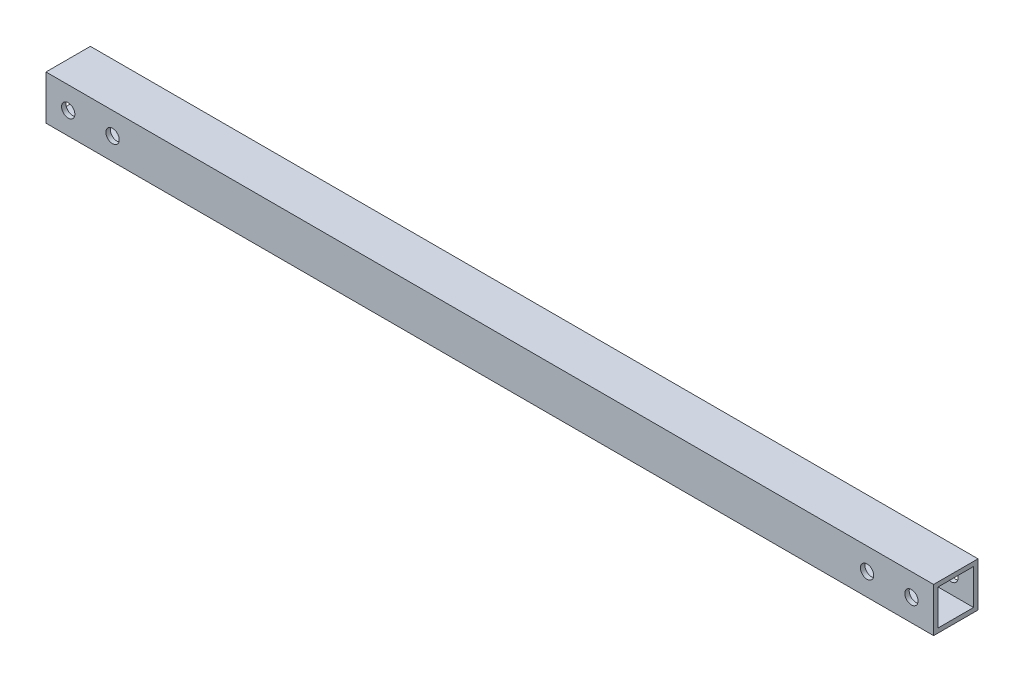
ISO-10303-21;
HEADER;
FILE_DESCRIPTION(('STEP AP214'),'2;1');
FILE_NAME('part.step','',(''),(''),'','','');
FILE_SCHEMA(('AUTOMOTIVE_DESIGN { 1 0 10303 214 1 1 1 1 }'));
ENDSEC;
DATA;
#1=APPLICATION_CONTEXT('core data for automotive mechanical design processes');
#2=APPLICATION_PROTOCOL_DEFINITION('international standard','automotive_design',2000,#1);
#3=PRODUCT_CONTEXT('',#1,'mechanical');
#4=PRODUCT('Part','Part','',(#3));
#5=PRODUCT_RELATED_PRODUCT_CATEGORY('part','',(#4));
#6=PRODUCT_DEFINITION_FORMATION('','',#4);
#7=PRODUCT_DEFINITION_CONTEXT('part definition',#1,'design');
#8=PRODUCT_DEFINITION('design','',#6,#7);
#9=PRODUCT_DEFINITION_SHAPE('','',#8);
#10=(LENGTH_UNIT() NAMED_UNIT(*) SI_UNIT(.MILLI.,.METRE.));
#11=(NAMED_UNIT(*) PLANE_ANGLE_UNIT() SI_UNIT($,.RADIAN.));
#12=(NAMED_UNIT(*) SI_UNIT($,.STERADIAN.) SOLID_ANGLE_UNIT());
#13=UNCERTAINTY_MEASURE_WITH_UNIT(LENGTH_MEASURE(1.E-05),#10,'distance_accuracy_value','');
#14=(GEOMETRIC_REPRESENTATION_CONTEXT(3) GLOBAL_UNCERTAINTY_ASSIGNED_CONTEXT((#13)) GLOBAL_UNIT_ASSIGNED_CONTEXT((#10,
#11,#12)) REPRESENTATION_CONTEXT('',''));
#15=CARTESIAN_POINT('',(0.,0.,0.));
#16=DIRECTION('',(0.,0.,1.));
#17=DIRECTION('',(1.,0.,0.));
#18=AXIS2_PLACEMENT_3D('',#15,#16,#17);
#19=CARTESIAN_POINT('',(200.,0.,0.));
#20=DIRECTION('',(1.,0.,0.));
#21=DIRECTION('',(0.,0.,-1.));
#22=AXIS2_PLACEMENT_3D('',#19,#20,#21);
#23=PLANE('',#22);
#24=DIRECTION('',(0.,-1.,0.));
#25=VECTOR('',#24,1.);
#26=CARTESIAN_POINT('',(200.,10.,10.));
#27=LINE('',#26,#25);
#28=CARTESIAN_POINT('',(200.,10.,10.));
#29=VERTEX_POINT('',#28);
#30=CARTESIAN_POINT('',(200.,-10.,10.));
#31=VERTEX_POINT('',#30);
#32=EDGE_CURVE('E140',#29,#31,#27,.T.);
#33=ORIENTED_EDGE('',*,*,#32,.T.);
#34=DIRECTION('',(0.,0.,-1.));
#35=VECTOR('',#34,1.);
#36=CARTESIAN_POINT('',(200.,-10.,10.));
#37=LINE('',#36,#35);
#38=CARTESIAN_POINT('',(200.,-10.,-10.));
#39=VERTEX_POINT('',#38);
#40=EDGE_CURVE('E143',#31,#39,#37,.T.);
#41=ORIENTED_EDGE('',*,*,#40,.T.);
#42=DIRECTION('',(0.,1.,0.));
#43=VECTOR('',#42,1.);
#44=CARTESIAN_POINT('',(200.,10.,-10.));
#45=LINE('',#44,#43);
#46=CARTESIAN_POINT('',(200.,10.,-10.));
#47=VERTEX_POINT('',#46);
#48=EDGE_CURVE('E146',#39,#47,#45,.T.);
#49=ORIENTED_EDGE('',*,*,#48,.T.);
#50=DIRECTION('',(0.,0.,1.));
#51=VECTOR('',#50,1.);
#52=CARTESIAN_POINT('',(200.,10.,10.));
#53=LINE('',#52,#51);
#54=EDGE_CURVE('E148',#47,#29,#53,.T.);
#55=ORIENTED_EDGE('',*,*,#54,.T.);
#56=EDGE_LOOP('',(#33,#41,#49,#55));
#57=FACE_BOUND('',#56,.T.);
#58=DIRECTION('',(0.,1.,0.));
#59=VECTOR('',#58,1.);
#60=CARTESIAN_POINT('',(200.,8.,-8.));
#61=LINE('',#60,#59);
#62=CARTESIAN_POINT('',(200.,-8.,-8.));
#63=VERTEX_POINT('',#62);
#64=CARTESIAN_POINT('',(200.,8.,-8.));
#65=VERTEX_POINT('',#64);
#66=EDGE_CURVE('E110',#63,#65,#61,.T.);
#67=ORIENTED_EDGE('',*,*,#66,.F.);
#68=DIRECTION('',(0.,0.,-1.));
#69=VECTOR('',#68,1.);
#70=CARTESIAN_POINT('',(200.,-8.,-8.));
#71=LINE('',#70,#69);
#72=CARTESIAN_POINT('',(200.,-8.,8.));
#73=VERTEX_POINT('',#72);
#74=EDGE_CURVE('E102',#73,#63,#71,.T.);
#75=ORIENTED_EDGE('',*,*,#74,.F.);
#76=DIRECTION('',(0.,-1.,0.));
#77=VECTOR('',#76,1.);
#78=CARTESIAN_POINT('',(200.,8.,8.));
#79=LINE('',#78,#77);
#80=CARTESIAN_POINT('',(200.,8.,8.));
#81=VERTEX_POINT('',#80);
#82=EDGE_CURVE('E124',#81,#73,#79,.T.);
#83=ORIENTED_EDGE('',*,*,#82,.F.);
#84=DIRECTION('',(0.,0.,1.));
#85=VECTOR('',#84,1.);
#86=CARTESIAN_POINT('',(200.,8.,-8.));
#87=LINE('',#86,#85);
#88=EDGE_CURVE('E122',#65,#81,#87,.T.);
#89=ORIENTED_EDGE('',*,*,#88,.F.);
#90=EDGE_LOOP('',(#67,#75,#83,#89));
#91=FACE_BOUND('',#90,.T.);
#92=ADVANCED_FACE('F35',(#57,#91),#23,.T.);
#93=CARTESIAN_POINT('',(-200.,0.,0.));
#94=DIRECTION('',(1.,0.,0.));
#95=DIRECTION('',(0.,0.,-1.));
#96=AXIS2_PLACEMENT_3D('',#93,#94,#95);
#97=PLANE('',#96);
#98=DIRECTION('',(0.,-1.,0.));
#99=VECTOR('',#98,1.);
#100=CARTESIAN_POINT('',(-200.,10.,10.));
#101=LINE('',#100,#99);
#102=CARTESIAN_POINT('',(-200.,10.,10.));
#103=VERTEX_POINT('',#102);
#104=CARTESIAN_POINT('',(-200.,-10.,10.));
#105=VERTEX_POINT('',#104);
#106=EDGE_CURVE('E118',#103,#105,#101,.T.);
#107=ORIENTED_EDGE('',*,*,#106,.F.);
#108=DIRECTION('',(0.,0.,1.));
#109=VECTOR('',#108,1.);
#110=CARTESIAN_POINT('',(-200.,10.,10.));
#111=LINE('',#110,#109);
#112=CARTESIAN_POINT('',(-200.,10.,-10.));
#113=VERTEX_POINT('',#112);
#114=EDGE_CURVE('E144',#113,#103,#111,.T.);
#115=ORIENTED_EDGE('',*,*,#114,.F.);
#116=DIRECTION('',(0.,1.,0.));
#117=VECTOR('',#116,1.);
#118=CARTESIAN_POINT('',(-200.,10.,-10.));
#119=LINE('',#118,#117);
#120=CARTESIAN_POINT('',(-200.,-10.,-10.));
#121=VERTEX_POINT('',#120);
#122=EDGE_CURVE('E155',#121,#113,#119,.T.);
#123=ORIENTED_EDGE('',*,*,#122,.F.);
#124=DIRECTION('',(0.,0.,-1.));
#125=VECTOR('',#124,1.);
#126=CARTESIAN_POINT('',(-200.,-10.,10.));
#127=LINE('',#126,#125);
#128=EDGE_CURVE('E153',#105,#121,#127,.T.);
#129=ORIENTED_EDGE('',*,*,#128,.F.);
#130=EDGE_LOOP('',(#107,#115,#123,#129));
#131=FACE_BOUND('',#130,.T.);
#132=DIRECTION('',(0.,0.,-1.));
#133=VECTOR('',#132,1.);
#134=CARTESIAN_POINT('',(-200.,-8.,-8.));
#135=LINE('',#134,#133);
#136=CARTESIAN_POINT('',(-200.,-8.,8.));
#137=VERTEX_POINT('',#136);
#138=CARTESIAN_POINT('',(-200.,-8.,-8.));
#139=VERTEX_POINT('',#138);
#140=EDGE_CURVE('E60',#137,#139,#135,.T.);
#141=ORIENTED_EDGE('',*,*,#140,.T.);
#142=DIRECTION('',(0.,1.,0.));
#143=VECTOR('',#142,1.);
#144=CARTESIAN_POINT('',(-200.,8.,-8.));
#145=LINE('',#144,#143);
#146=CARTESIAN_POINT('',(-200.,8.,-8.));
#147=VERTEX_POINT('',#146);
#148=EDGE_CURVE('E117',#139,#147,#145,.T.);
#149=ORIENTED_EDGE('',*,*,#148,.T.);
#150=DIRECTION('',(0.,0.,1.));
#151=VECTOR('',#150,1.);
#152=CARTESIAN_POINT('',(-200.,8.,-8.));
#153=LINE('',#152,#151);
#154=CARTESIAN_POINT('',(-200.,8.,8.));
#155=VERTEX_POINT('',#154);
#156=EDGE_CURVE('E132',#147,#155,#153,.T.);
#157=ORIENTED_EDGE('',*,*,#156,.T.);
#158=DIRECTION('',(0.,-1.,0.));
#159=VECTOR('',#158,1.);
#160=CARTESIAN_POINT('',(-200.,8.,8.));
#161=LINE('',#160,#159);
#162=EDGE_CURVE('E111',#155,#137,#161,.T.);
#163=ORIENTED_EDGE('',*,*,#162,.T.);
#164=EDGE_LOOP('',(#141,#149,#157,#163));
#165=FACE_BOUND('',#164,.T.);
#166=ADVANCED_FACE('F227',(#131,#165),#97,.F.);
#167=CARTESIAN_POINT('',(200.,10.,10.));
#168=DIRECTION('',(0.,0.,-1.));
#169=DIRECTION('',(-1.,0.,0.));
#170=AXIS2_PLACEMENT_3D('',#167,#168,#169);
#171=PLANE('',#170);
#172=CARTESIAN_POINT('',(-190.,0.,10.));
#173=DIRECTION('',(0.,0.,1.));
#174=DIRECTION('',(1.,0.,0.));
#175=AXIS2_PLACEMENT_3D('',#172,#173,#174);
#176=CIRCLE('',#175,2.99999999999999);
#177=CARTESIAN_POINT('',(-187.,0.,10.));
#178=VERTEX_POINT('',#177);
#179=EDGE_CURVE('E299',#178,#178,#176,.T.);
#180=ORIENTED_EDGE('',*,*,#179,.F.);
#181=EDGE_LOOP('',(#180));
#182=FACE_BOUND('',#181,.T.);
#183=CARTESIAN_POINT('',(-170.,0.,10.));
#184=DIRECTION('',(0.,0.,1.));
#185=DIRECTION('',(1.,0.,0.));
#186=AXIS2_PLACEMENT_3D('',#183,#184,#185);
#187=CIRCLE('',#186,2.99999999999999);
#188=CARTESIAN_POINT('',(-167.,0.,10.));
#189=VERTEX_POINT('',#188);
#190=EDGE_CURVE('E183',#189,#189,#187,.T.);
#191=ORIENTED_EDGE('',*,*,#190,.F.);
#192=EDGE_LOOP('',(#191));
#193=FACE_BOUND('',#192,.T.);
#194=CARTESIAN_POINT('',(170.,0.,10.));
#195=DIRECTION('',(0.,0.,1.));
#196=DIRECTION('',(1.,0.,0.));
#197=AXIS2_PLACEMENT_3D('',#194,#195,#196);
#198=CIRCLE('',#197,2.99999999999999);
#199=CARTESIAN_POINT('',(173.,0.,10.));
#200=VERTEX_POINT('',#199);
#201=EDGE_CURVE('E180',#200,#200,#198,.T.);
#202=ORIENTED_EDGE('',*,*,#201,.F.);
#203=EDGE_LOOP('',(#202));
#204=FACE_BOUND('',#203,.T.);
#205=CARTESIAN_POINT('',(190.,0.,10.));
#206=DIRECTION('',(0.,0.,1.));
#207=DIRECTION('',(1.,0.,0.));
#208=AXIS2_PLACEMENT_3D('',#205,#206,#207);
#209=CIRCLE('',#208,2.99999999999999);
#210=CARTESIAN_POINT('',(193.,0.,10.));
#211=VERTEX_POINT('',#210);
#212=EDGE_CURVE('E199',#211,#211,#209,.T.);
#213=ORIENTED_EDGE('',*,*,#212,.F.);
#214=EDGE_LOOP('',(#213));
#215=FACE_BOUND('',#214,.T.);
#216=ORIENTED_EDGE('',*,*,#106,.T.);
#217=DIRECTION('',(-1.,0.,0.));
#218=VECTOR('',#217,1.);
#219=CARTESIAN_POINT('',(200.,-10.,10.));
#220=LINE('',#219,#218);
#221=EDGE_CURVE('E11',#31,#105,#220,.T.);
#222=ORIENTED_EDGE('',*,*,#221,.F.);
#223=ORIENTED_EDGE('',*,*,#32,.F.);
#224=DIRECTION('',(-1.,0.,0.));
#225=VECTOR('',#224,1.);
#226=CARTESIAN_POINT('',(200.,10.,10.));
#227=LINE('',#226,#225);
#228=EDGE_CURVE('E150',#29,#103,#227,.T.);
#229=ORIENTED_EDGE('',*,*,#228,.T.);
#230=EDGE_LOOP('',(#216,#222,#223,#229));
#231=FACE_BOUND('',#230,.T.);
#232=ADVANCED_FACE('F37',(#182,#193,#204,#215,#231),#171,.F.);
#233=CARTESIAN_POINT('',(200.,-10.,10.));
#234=DIRECTION('',(0.,1.,0.));
#235=DIRECTION('',(0.,0.,1.));
#236=AXIS2_PLACEMENT_3D('',#233,#234,#235);
#237=PLANE('',#236);
#238=ORIENTED_EDGE('',*,*,#128,.T.);
#239=DIRECTION('',(-1.,0.,0.));
#240=VECTOR('',#239,1.);
#241=CARTESIAN_POINT('',(200.,-10.,-10.));
#242=LINE('',#241,#240);
#243=EDGE_CURVE('E44',#39,#121,#242,.T.);
#244=ORIENTED_EDGE('',*,*,#243,.F.);
#245=ORIENTED_EDGE('',*,*,#40,.F.);
#246=ORIENTED_EDGE('',*,*,#221,.T.);
#247=EDGE_LOOP('',(#238,#244,#245,#246));
#248=FACE_BOUND('',#247,.T.);
#249=ADVANCED_FACE('F240',(#248),#237,.F.);
#250=CARTESIAN_POINT('',(200.,10.,-10.));
#251=DIRECTION('',(0.,0.,1.));
#252=DIRECTION('',(1.,0.,0.));
#253=AXIS2_PLACEMENT_3D('',#250,#251,#252);
#254=PLANE('',#253);
#255=CARTESIAN_POINT('',(-190.,0.,-10.));
#256=DIRECTION('',(0.,0.,1.));
#257=DIRECTION('',(1.,0.,0.));
#258=AXIS2_PLACEMENT_3D('',#255,#256,#257);
#259=CIRCLE('',#258,2.99999999999999);
#260=CARTESIAN_POINT('',(-187.,0.,-10.));
#261=VERTEX_POINT('',#260);
#262=EDGE_CURVE('E300',#261,#261,#259,.T.);
#263=ORIENTED_EDGE('',*,*,#262,.T.);
#264=EDGE_LOOP('',(#263));
#265=FACE_BOUND('',#264,.T.);
#266=CARTESIAN_POINT('',(-170.,0.,-10.));
#267=DIRECTION('',(0.,0.,1.));
#268=DIRECTION('',(1.,0.,0.));
#269=AXIS2_PLACEMENT_3D('',#266,#267,#268);
#270=CIRCLE('',#269,2.99999999999999);
#271=CARTESIAN_POINT('',(-167.,0.,-10.));
#272=VERTEX_POINT('',#271);
#273=EDGE_CURVE('E176',#272,#272,#270,.T.);
#274=ORIENTED_EDGE('',*,*,#273,.T.);
#275=EDGE_LOOP('',(#274));
#276=FACE_BOUND('',#275,.T.);
#277=CARTESIAN_POINT('',(170.,0.,-10.));
#278=DIRECTION('',(0.,0.,1.));
#279=DIRECTION('',(1.,0.,0.));
#280=AXIS2_PLACEMENT_3D('',#277,#278,#279);
#281=CIRCLE('',#280,2.99999999999999);
#282=CARTESIAN_POINT('',(173.,0.,-10.));
#283=VERTEX_POINT('',#282);
#284=EDGE_CURVE('E172',#283,#283,#281,.T.);
#285=ORIENTED_EDGE('',*,*,#284,.T.);
#286=EDGE_LOOP('',(#285));
#287=FACE_BOUND('',#286,.T.);
#288=CARTESIAN_POINT('',(190.,0.,-10.));
#289=DIRECTION('',(0.,0.,1.));
#290=DIRECTION('',(1.,0.,0.));
#291=AXIS2_PLACEMENT_3D('',#288,#289,#290);
#292=CIRCLE('',#291,2.99999999999999);
#293=CARTESIAN_POINT('',(193.,0.,-10.));
#294=VERTEX_POINT('',#293);
#295=EDGE_CURVE('E168',#294,#294,#292,.T.);
#296=ORIENTED_EDGE('',*,*,#295,.T.);
#297=EDGE_LOOP('',(#296));
#298=FACE_BOUND('',#297,.T.);
#299=ORIENTED_EDGE('',*,*,#122,.T.);
#300=DIRECTION('',(-1.,0.,0.));
#301=VECTOR('',#300,1.);
#302=CARTESIAN_POINT('',(200.,10.,-10.));
#303=LINE('',#302,#301);
#304=EDGE_CURVE('E160',#47,#113,#303,.T.);
#305=ORIENTED_EDGE('',*,*,#304,.F.);
#306=ORIENTED_EDGE('',*,*,#48,.F.);
#307=ORIENTED_EDGE('',*,*,#243,.T.);
#308=EDGE_LOOP('',(#299,#305,#306,#307));
#309=FACE_BOUND('',#308,.T.);
#310=ADVANCED_FACE('F238',(#265,#276,#287,#298,#309),#254,.F.);
#311=CARTESIAN_POINT('',(200.,10.,10.));
#312=DIRECTION('',(0.,-1.,0.));
#313=DIRECTION('',(0.,0.,-1.));
#314=AXIS2_PLACEMENT_3D('',#311,#312,#313);
#315=PLANE('',#314);
#316=ORIENTED_EDGE('',*,*,#114,.T.);
#317=ORIENTED_EDGE('',*,*,#228,.F.);
#318=ORIENTED_EDGE('',*,*,#54,.F.);
#319=ORIENTED_EDGE('',*,*,#304,.T.);
#320=EDGE_LOOP('',(#316,#317,#318,#319));
#321=FACE_BOUND('',#320,.T.);
#322=ADVANCED_FACE('F222',(#321),#315,.F.);
#323=CARTESIAN_POINT('',(200.,-8.,-8.));
#324=DIRECTION('',(0.,1.,0.));
#325=DIRECTION('',(0.,0.,1.));
#326=AXIS2_PLACEMENT_3D('',#323,#324,#325);
#327=PLANE('',#326);
#328=ORIENTED_EDGE('',*,*,#140,.F.);
#329=DIRECTION('',(-1.,0.,0.));
#330=VECTOR('',#329,1.);
#331=CARTESIAN_POINT('',(200.,-8.,8.));
#332=LINE('',#331,#330);
#333=EDGE_CURVE('E106',#73,#137,#332,.T.);
#334=ORIENTED_EDGE('',*,*,#333,.F.);
#335=ORIENTED_EDGE('',*,*,#74,.T.);
#336=DIRECTION('',(-1.,0.,0.));
#337=VECTOR('',#336,1.);
#338=CARTESIAN_POINT('',(200.,-8.,-8.));
#339=LINE('',#338,#337);
#340=EDGE_CURVE('E105',#63,#139,#339,.T.);
#341=ORIENTED_EDGE('',*,*,#340,.T.);
#342=EDGE_LOOP('',(#328,#334,#335,#341));
#343=FACE_BOUND('',#342,.T.);
#344=ADVANCED_FACE('F104',(#343),#327,.T.);
#345=CARTESIAN_POINT('',(200.,8.,-8.));
#346=DIRECTION('',(0.,0.,1.));
#347=DIRECTION('',(1.,0.,0.));
#348=AXIS2_PLACEMENT_3D('',#345,#346,#347);
#349=PLANE('',#348);
#350=CARTESIAN_POINT('',(-190.,0.,-8.));
#351=DIRECTION('',(0.,0.,1.));
#352=DIRECTION('',(1.,0.,0.));
#353=AXIS2_PLACEMENT_3D('',#350,#351,#352);
#354=CIRCLE('',#353,2.99999999999999);
#355=CARTESIAN_POINT('',(-187.,0.,-8.));
#356=VERTEX_POINT('',#355);
#357=EDGE_CURVE('E188',#356,#356,#354,.T.);
#358=ORIENTED_EDGE('',*,*,#357,.F.);
#359=EDGE_LOOP('',(#358));
#360=FACE_BOUND('',#359,.T.);
#361=CARTESIAN_POINT('',(-170.,0.,-8.));
#362=DIRECTION('',(0.,0.,1.));
#363=DIRECTION('',(1.,0.,0.));
#364=AXIS2_PLACEMENT_3D('',#361,#362,#363);
#365=CIRCLE('',#364,2.99999999999999);
#366=CARTESIAN_POINT('',(-167.,0.,-8.));
#367=VERTEX_POINT('',#366);
#368=EDGE_CURVE('E175',#367,#367,#365,.T.);
#369=ORIENTED_EDGE('',*,*,#368,.F.);
#370=EDGE_LOOP('',(#369));
#371=FACE_BOUND('',#370,.T.);
#372=CARTESIAN_POINT('',(170.,0.,-8.));
#373=DIRECTION('',(0.,0.,1.));
#374=DIRECTION('',(1.,0.,0.));
#375=AXIS2_PLACEMENT_3D('',#372,#373,#374);
#376=CIRCLE('',#375,2.99999999999999);
#377=CARTESIAN_POINT('',(173.,0.,-8.));
#378=VERTEX_POINT('',#377);
#379=EDGE_CURVE('E171',#378,#378,#376,.T.);
#380=ORIENTED_EDGE('',*,*,#379,.F.);
#381=EDGE_LOOP('',(#380));
#382=FACE_BOUND('',#381,.T.);
#383=CARTESIAN_POINT('',(190.,0.,-8.));
#384=DIRECTION('',(0.,0.,1.));
#385=DIRECTION('',(1.,0.,0.));
#386=AXIS2_PLACEMENT_3D('',#383,#384,#385);
#387=CIRCLE('',#386,2.99999999999999);
#388=CARTESIAN_POINT('',(193.,0.,-8.));
#389=VERTEX_POINT('',#388);
#390=EDGE_CURVE('E130',#389,#389,#387,.T.);
#391=ORIENTED_EDGE('',*,*,#390,.F.);
#392=EDGE_LOOP('',(#391));
#393=FACE_BOUND('',#392,.T.);
#394=ORIENTED_EDGE('',*,*,#148,.F.);
#395=ORIENTED_EDGE('',*,*,#340,.F.);
#396=ORIENTED_EDGE('',*,*,#66,.T.);
#397=DIRECTION('',(-1.,0.,0.));
#398=VECTOR('',#397,1.);
#399=CARTESIAN_POINT('',(200.,8.,-8.));
#400=LINE('',#399,#398);
#401=EDGE_CURVE('E119',#65,#147,#400,.T.);
#402=ORIENTED_EDGE('',*,*,#401,.T.);
#403=EDGE_LOOP('',(#394,#395,#396,#402));
#404=FACE_BOUND('',#403,.T.);
#405=ADVANCED_FACE('F114',(#360,#371,#382,#393,#404),#349,.T.);
#406=CARTESIAN_POINT('',(200.,8.,-8.));
#407=DIRECTION('',(0.,-1.,0.));
#408=DIRECTION('',(0.,0.,-1.));
#409=AXIS2_PLACEMENT_3D('',#406,#407,#408);
#410=PLANE('',#409);
#411=ORIENTED_EDGE('',*,*,#156,.F.);
#412=ORIENTED_EDGE('',*,*,#401,.F.);
#413=ORIENTED_EDGE('',*,*,#88,.T.);
#414=DIRECTION('',(-1.,0.,0.));
#415=VECTOR('',#414,1.);
#416=CARTESIAN_POINT('',(200.,8.,8.));
#417=LINE('',#416,#415);
#418=EDGE_CURVE('E52',#81,#155,#417,.T.);
#419=ORIENTED_EDGE('',*,*,#418,.T.);
#420=EDGE_LOOP('',(#411,#412,#413,#419));
#421=FACE_BOUND('',#420,.T.);
#422=ADVANCED_FACE('F210',(#421),#410,.T.);
#423=CARTESIAN_POINT('',(200.,8.,8.));
#424=DIRECTION('',(0.,0.,-1.));
#425=DIRECTION('',(-1.,0.,0.));
#426=AXIS2_PLACEMENT_3D('',#423,#424,#425);
#427=PLANE('',#426);
#428=CARTESIAN_POINT('',(-190.,0.,8.));
#429=DIRECTION('',(0.,0.,-1.));
#430=DIRECTION('',(-1.,0.,0.));
#431=AXIS2_PLACEMENT_3D('',#428,#429,#430);
#432=CIRCLE('',#431,2.99999999999999);
#433=CARTESIAN_POINT('',(-193.,0.,8.));
#434=VERTEX_POINT('',#433);
#435=EDGE_CURVE('E39',#434,#434,#432,.T.);
#436=ORIENTED_EDGE('',*,*,#435,.F.);
#437=EDGE_LOOP('',(#436));
#438=FACE_BOUND('',#437,.T.);
#439=CARTESIAN_POINT('',(-170.,0.,8.));
#440=DIRECTION('',(0.,0.,-1.));
#441=DIRECTION('',(-1.,0.,0.));
#442=AXIS2_PLACEMENT_3D('',#439,#440,#441);
#443=CIRCLE('',#442,2.99999999999999);
#444=CARTESIAN_POINT('',(-173.,0.,8.));
#445=VERTEX_POINT('',#444);
#446=EDGE_CURVE('E173',#445,#445,#443,.T.);
#447=ORIENTED_EDGE('',*,*,#446,.F.);
#448=EDGE_LOOP('',(#447));
#449=FACE_BOUND('',#448,.T.);
#450=CARTESIAN_POINT('',(170.,0.,8.));
#451=DIRECTION('',(0.,0.,-1.));
#452=DIRECTION('',(-1.,0.,0.));
#453=AXIS2_PLACEMENT_3D('',#450,#451,#452);
#454=CIRCLE('',#453,2.99999999999999);
#455=CARTESIAN_POINT('',(167.,0.,8.));
#456=VERTEX_POINT('',#455);
#457=EDGE_CURVE('E169',#456,#456,#454,.T.);
#458=ORIENTED_EDGE('',*,*,#457,.F.);
#459=EDGE_LOOP('',(#458));
#460=FACE_BOUND('',#459,.T.);
#461=CARTESIAN_POINT('',(190.,0.,8.));
#462=DIRECTION('',(0.,0.,-1.));
#463=DIRECTION('',(-1.,0.,0.));
#464=AXIS2_PLACEMENT_3D('',#461,#462,#463);
#465=CIRCLE('',#464,2.99999999999999);
#466=CARTESIAN_POINT('',(187.,0.,8.));
#467=VERTEX_POINT('',#466);
#468=EDGE_CURVE('E165',#467,#467,#465,.T.);
#469=ORIENTED_EDGE('',*,*,#468,.F.);
#470=EDGE_LOOP('',(#469));
#471=FACE_BOUND('',#470,.T.);
#472=ORIENTED_EDGE('',*,*,#162,.F.);
#473=ORIENTED_EDGE('',*,*,#418,.F.);
#474=ORIENTED_EDGE('',*,*,#82,.T.);
#475=ORIENTED_EDGE('',*,*,#333,.T.);
#476=EDGE_LOOP('',(#472,#473,#474,#475));
#477=FACE_BOUND('',#476,.T.);
#478=ADVANCED_FACE('F218',(#438,#449,#460,#471,#477),#427,.T.);
#479=CARTESIAN_POINT('',(190.,0.,-10.));
#480=DIRECTION('',(0.,0.,1.));
#481=DIRECTION('',(1.,0.,0.));
#482=AXIS2_PLACEMENT_3D('',#479,#480,#481);
#483=CYLINDRICAL_SURFACE('',#482,2.99999999999999);
#484=ORIENTED_EDGE('',*,*,#468,.T.);
#485=EDGE_LOOP('',(#484));
#486=FACE_BOUND('',#485,.T.);
#487=ORIENTED_EDGE('',*,*,#212,.T.);
#488=EDGE_LOOP('',(#487));
#489=FACE_BOUND('',#488,.T.);
#490=ADVANCED_FACE('F264',(#486,#489),#483,.F.);
#491=ORIENTED_EDGE('',*,*,#390,.T.);
#492=EDGE_LOOP('',(#491));
#493=FACE_BOUND('',#492,.T.);
#494=ORIENTED_EDGE('',*,*,#295,.F.);
#495=EDGE_LOOP('',(#494));
#496=FACE_BOUND('',#495,.T.);
#497=ADVANCED_FACE('F206',(#493,#496),#483,.F.);
#498=CARTESIAN_POINT('',(170.,0.,-10.));
#499=DIRECTION('',(0.,0.,1.));
#500=DIRECTION('',(1.,0.,0.));
#501=AXIS2_PLACEMENT_3D('',#498,#499,#500);
#502=CYLINDRICAL_SURFACE('',#501,2.99999999999999);
#503=ORIENTED_EDGE('',*,*,#457,.T.);
#504=EDGE_LOOP('',(#503));
#505=FACE_BOUND('',#504,.T.);
#506=ORIENTED_EDGE('',*,*,#201,.T.);
#507=EDGE_LOOP('',(#506));
#508=FACE_BOUND('',#507,.T.);
#509=ADVANCED_FACE('F276',(#505,#508),#502,.F.);
#510=ORIENTED_EDGE('',*,*,#379,.T.);
#511=EDGE_LOOP('',(#510));
#512=FACE_BOUND('',#511,.T.);
#513=ORIENTED_EDGE('',*,*,#284,.F.);
#514=EDGE_LOOP('',(#513));
#515=FACE_BOUND('',#514,.T.);
#516=ADVANCED_FACE('F279',(#512,#515),#502,.F.);
#517=CARTESIAN_POINT('',(-170.,0.,-10.));
#518=DIRECTION('',(0.,0.,1.));
#519=DIRECTION('',(1.,0.,0.));
#520=AXIS2_PLACEMENT_3D('',#517,#518,#519);
#521=CYLINDRICAL_SURFACE('',#520,2.99999999999999);
#522=ORIENTED_EDGE('',*,*,#446,.T.);
#523=EDGE_LOOP('',(#522));
#524=FACE_BOUND('',#523,.T.);
#525=ORIENTED_EDGE('',*,*,#190,.T.);
#526=EDGE_LOOP('',(#525));
#527=FACE_BOUND('',#526,.T.);
#528=ADVANCED_FACE('F281',(#524,#527),#521,.F.);
#529=ORIENTED_EDGE('',*,*,#368,.T.);
#530=EDGE_LOOP('',(#529));
#531=FACE_BOUND('',#530,.T.);
#532=ORIENTED_EDGE('',*,*,#273,.F.);
#533=EDGE_LOOP('',(#532));
#534=FACE_BOUND('',#533,.T.);
#535=ADVANCED_FACE('F284',(#531,#534),#521,.F.);
#536=CARTESIAN_POINT('',(-190.,0.,-10.));
#537=DIRECTION('',(0.,0.,1.));
#538=DIRECTION('',(1.,0.,0.));
#539=AXIS2_PLACEMENT_3D('',#536,#537,#538);
#540=CYLINDRICAL_SURFACE('',#539,2.99999999999999);
#541=ORIENTED_EDGE('',*,*,#435,.T.);
#542=EDGE_LOOP('',(#541));
#543=FACE_BOUND('',#542,.T.);
#544=ORIENTED_EDGE('',*,*,#179,.T.);
#545=EDGE_LOOP('',(#544));
#546=FACE_BOUND('',#545,.T.);
#547=ADVANCED_FACE('F285',(#543,#546),#540,.F.);
#548=ORIENTED_EDGE('',*,*,#357,.T.);
#549=EDGE_LOOP('',(#548));
#550=FACE_BOUND('',#549,.T.);
#551=ORIENTED_EDGE('',*,*,#262,.F.);
#552=EDGE_LOOP('',(#551));
#553=FACE_BOUND('',#552,.T.);
#554=ADVANCED_FACE('F287',(#550,#553),#540,.F.);
#555=CLOSED_SHELL('',(#92,#166,#232,#249,#310,#322,#344,#405,#422,#478,#490,#497,#509,#516,#528,
#535,#547,#554));
#556=MANIFOLD_SOLID_BREP('B2',#555);
#557=ADVANCED_BREP_SHAPE_REPRESENTATION('',(#18,#556),#14);
#558=SHAPE_DEFINITION_REPRESENTATION(#9,#557);
ENDSEC;
END-ISO-10303-21;
